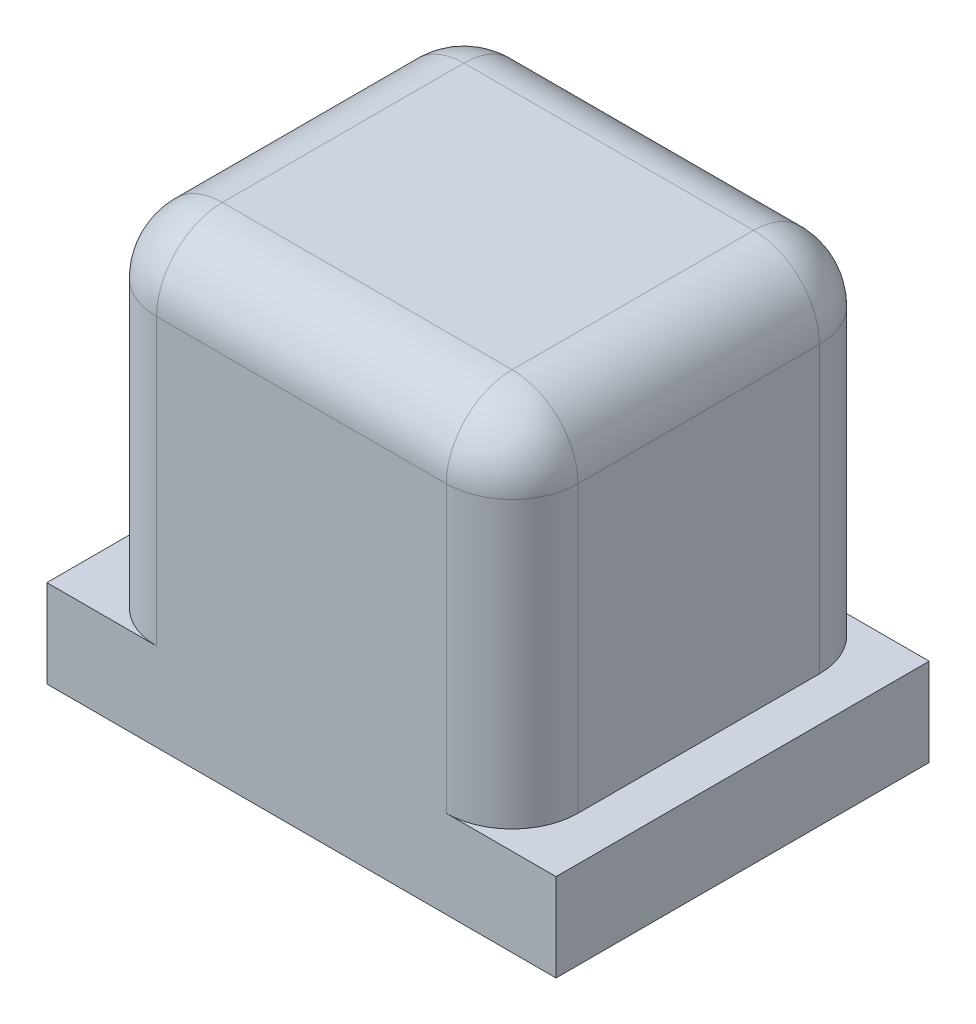
ISO-10303-21;
HEADER;
FILE_DESCRIPTION(('STEP AP214'),'2;1');
FILE_NAME('part.step','',(''),(''),'','','');
FILE_SCHEMA(('AUTOMOTIVE_DESIGN { 1 0 10303 214 1 1 1 1 }'));
ENDSEC;
DATA;
#1=APPLICATION_CONTEXT('core data for automotive mechanical design processes');
#2=APPLICATION_PROTOCOL_DEFINITION('international standard','automotive_design',2000,#1);
#3=PRODUCT_CONTEXT('',#1,'mechanical');
#4=PRODUCT('Part','Part','',(#3));
#5=PRODUCT_RELATED_PRODUCT_CATEGORY('part','',(#4));
#6=PRODUCT_DEFINITION_FORMATION('','',#4);
#7=PRODUCT_DEFINITION_CONTEXT('part definition',#1,'design');
#8=PRODUCT_DEFINITION('design','',#6,#7);
#9=PRODUCT_DEFINITION_SHAPE('','',#8);
#10=(LENGTH_UNIT() NAMED_UNIT(*) SI_UNIT(.MILLI.,.METRE.));
#11=(NAMED_UNIT(*) PLANE_ANGLE_UNIT() SI_UNIT($,.RADIAN.));
#12=(NAMED_UNIT(*) SI_UNIT($,.STERADIAN.) SOLID_ANGLE_UNIT());
#13=UNCERTAINTY_MEASURE_WITH_UNIT(LENGTH_MEASURE(1.E-05),#10,'distance_accuracy_value','');
#14=(GEOMETRIC_REPRESENTATION_CONTEXT(3) GLOBAL_UNCERTAINTY_ASSIGNED_CONTEXT((#13)) GLOBAL_UNIT_ASSIGNED_CONTEXT((#10,
#11,#12)) REPRESENTATION_CONTEXT('',''));
#15=CARTESIAN_POINT('',(0.,0.,0.));
#16=DIRECTION('',(0.,0.,1.));
#17=DIRECTION('',(1.,0.,0.));
#18=AXIS2_PLACEMENT_3D('',#15,#16,#17);
#19=CARTESIAN_POINT('',(0.,55.75,8.5));
#20=DIRECTION('',(0.,1.,0.));
#21=DIRECTION('',(0.,0.,1.));
#22=AXIS2_PLACEMENT_3D('',#19,#20,#21);
#23=PLANE('',#22);
#24=DIRECTION('',(1.,0.,0.));
#25=VECTOR('',#24,1.);
#26=CARTESIAN_POINT('',(-12.55,55.75,1.5));
#27=LINE('',#26,#25);
#28=CARTESIAN_POINT('',(-4.44999999999996,55.75,1.5));
#29=VERTEX_POINT('',#28);
#30=CARTESIAN_POINT('',(-11.05,55.75,1.5));
#31=VERTEX_POINT('',#30);
#32=EDGE_CURVE('E210',#29,#31,#27,.F.);
#33=ORIENTED_EDGE('',*,*,#32,.T.);
#34=DIRECTION('',(0.,0.,-1.));
#35=VECTOR('',#34,1.);
#36=CARTESIAN_POINT('',(-11.05,55.75,8.5));
#37=LINE('',#36,#35);
#38=CARTESIAN_POINT('',(-11.05,55.75,7.));
#39=VERTEX_POINT('',#38);
#40=EDGE_CURVE('E212',#31,#39,#37,.F.);
#41=ORIENTED_EDGE('',*,*,#40,.T.);
#42=DIRECTION('',(1.,0.,0.));
#43=VECTOR('',#42,1.);
#44=CARTESIAN_POINT('',(0.,55.75,7.));
#45=LINE('',#44,#43);
#46=CARTESIAN_POINT('',(-4.44999999999996,55.75,7.));
#47=VERTEX_POINT('',#46);
#48=EDGE_CURVE('E206',#39,#47,#45,.T.);
#49=ORIENTED_EDGE('',*,*,#48,.T.);
#50=DIRECTION('',(0.,0.,-1.));
#51=VECTOR('',#50,1.);
#52=CARTESIAN_POINT('',(-4.44999999999996,55.75,8.5));
#53=LINE('',#52,#51);
#54=EDGE_CURVE('E208',#47,#29,#53,.T.);
#55=ORIENTED_EDGE('',*,*,#54,.T.);
#56=EDGE_LOOP('',(#33,#41,#49,#55));
#57=FACE_BOUND('',#56,.T.);
#58=ADVANCED_FACE('F35',(#57),#23,.T.);
#59=CARTESIAN_POINT('',(-12.55,0.,8.5));
#60=DIRECTION('',(1.,0.,0.));
#61=DIRECTION('',(0.,1.,0.));
#62=AXIS2_PLACEMENT_3D('',#59,#60,#61);
#63=PLANE('',#62);
#64=DIRECTION('',(0.,0.,-1.));
#65=VECTOR('',#64,1.);
#66=CARTESIAN_POINT('',(-12.55,54.25,0.));
#67=LINE('',#66,#65);
#68=CARTESIAN_POINT('',(-12.55,54.25,7.));
#69=VERTEX_POINT('',#68);
#70=CARTESIAN_POINT('',(-12.55,54.25,1.5));
#71=VERTEX_POINT('',#70);
#72=EDGE_CURVE('E202',#69,#71,#67,.T.);
#73=ORIENTED_EDGE('',*,*,#72,.T.);
#74=DIRECTION('',(0.,-1.,0.));
#75=VECTOR('',#74,1.);
#76=CARTESIAN_POINT('',(-12.55,0.,1.5));
#77=LINE('',#76,#75);
#78=CARTESIAN_POINT('',(-12.55,47.75,1.5));
#79=VERTEX_POINT('',#78);
#80=EDGE_CURVE('E204',#71,#79,#77,.T.);
#81=ORIENTED_EDGE('',*,*,#80,.T.);
#82=DIRECTION('',(0.,0.,-1.));
#83=VECTOR('',#82,1.);
#84=CARTESIAN_POINT('',(-12.55,47.75,8.5));
#85=LINE('',#84,#83);
#86=CARTESIAN_POINT('',(-12.55,47.75,7.));
#87=VERTEX_POINT('',#86);
#88=EDGE_CURVE('E154',#87,#79,#85,.T.);
#89=ORIENTED_EDGE('',*,*,#88,.F.);
#90=DIRECTION('',(0.,-1.,0.));
#91=VECTOR('',#90,1.);
#92=CARTESIAN_POINT('',(-12.55,55.75,7.));
#93=LINE('',#92,#91);
#94=EDGE_CURVE('E200',#87,#69,#93,.F.);
#95=ORIENTED_EDGE('',*,*,#94,.T.);
#96=EDGE_LOOP('',(#73,#81,#89,#95));
#97=FACE_BOUND('',#96,.T.);
#98=ADVANCED_FACE('F268',(#97),#63,.F.);
#99=CARTESIAN_POINT('',(0.,47.75,8.5));
#100=DIRECTION('',(0.,-1.,0.));
#101=DIRECTION('',(0.,0.,-1.));
#102=AXIS2_PLACEMENT_3D('',#99,#100,#101);
#103=PLANE('',#102);
#104=DIRECTION('',(-1.,0.,0.));
#105=VECTOR('',#104,1.);
#106=CARTESIAN_POINT('',(0.,47.75,0.));
#107=LINE('',#106,#105);
#108=CARTESIAN_POINT('',(-11.05,47.75,0.));
#109=VERTEX_POINT('',#108);
#110=CARTESIAN_POINT('',(-13.55,47.75,0.));
#111=VERTEX_POINT('',#110);
#112=EDGE_CURVE('E150',#109,#111,#107,.T.);
#113=ORIENTED_EDGE('',*,*,#112,.T.);
#114=DIRECTION('',(0.,0.,-1.));
#115=VECTOR('',#114,1.);
#116=CARTESIAN_POINT('',(-13.55,47.75,8.5));
#117=LINE('',#116,#115);
#118=CARTESIAN_POINT('',(-13.55,47.75,8.5));
#119=VERTEX_POINT('',#118);
#120=EDGE_CURVE('E147',#119,#111,#117,.T.);
#121=ORIENTED_EDGE('',*,*,#120,.F.);
#122=DIRECTION('',(-1.,0.,0.));
#123=VECTOR('',#122,1.);
#124=CARTESIAN_POINT('',(0.,47.75,8.5));
#125=LINE('',#124,#123);
#126=CARTESIAN_POINT('',(-11.05,47.75,8.5));
#127=VERTEX_POINT('',#126);
#128=EDGE_CURVE('E135',#127,#119,#125,.T.);
#129=ORIENTED_EDGE('',*,*,#128,.F.);
#130=CARTESIAN_POINT('',(-11.05,47.75,7.));
#131=DIRECTION('',(0.,-1.,0.));
#132=DIRECTION('',(0.,0.,-1.));
#133=AXIS2_PLACEMENT_3D('',#130,#131,#132);
#134=CIRCLE('',#133,1.5);
#135=EDGE_CURVE('E11',#127,#87,#134,.T.);
#136=ORIENTED_EDGE('',*,*,#135,.T.);
#137=ORIENTED_EDGE('',*,*,#88,.T.);
#138=CARTESIAN_POINT('',(-11.05,47.75,1.5));
#139=DIRECTION('',(0.,-1.,0.));
#140=DIRECTION('',(0.,0.,-1.));
#141=AXIS2_PLACEMENT_3D('',#138,#139,#140);
#142=CIRCLE('',#141,1.5);
#143=EDGE_CURVE('E221',#79,#109,#142,.T.);
#144=ORIENTED_EDGE('',*,*,#143,.T.);
#145=EDGE_LOOP('',(#113,#121,#129,#136,#137,#144));
#146=FACE_BOUND('',#145,.T.);
#147=ADVANCED_FACE('F148',(#146),#103,.F.);
#148=CARTESIAN_POINT('',(-13.5499999999999,0.,8.5));
#149=DIRECTION('',(-1.,0.,0.));
#150=DIRECTION('',(0.,-1.,0.));
#151=AXIS2_PLACEMENT_3D('',#148,#149,#150);
#152=PLANE('',#151);
#153=DIRECTION('',(0.,1.,0.));
#154=VECTOR('',#153,1.);
#155=CARTESIAN_POINT('',(-13.5499999999999,0.,0.));
#156=LINE('',#155,#154);
#157=CARTESIAN_POINT('',(-13.55,45.75,0.));
#158=VERTEX_POINT('',#157);
#159=EDGE_CURVE('E168',#158,#111,#156,.T.);
#160=ORIENTED_EDGE('',*,*,#159,.F.);
#161=DIRECTION('',(0.,0.,-1.));
#162=VECTOR('',#161,1.);
#163=CARTESIAN_POINT('',(-13.55,45.75,8.5));
#164=LINE('',#163,#162);
#165=CARTESIAN_POINT('',(-13.55,45.75,8.5));
#166=VERTEX_POINT('',#165);
#167=EDGE_CURVE('E155',#166,#158,#164,.T.);
#168=ORIENTED_EDGE('',*,*,#167,.F.);
#169=DIRECTION('',(0.,1.,0.));
#170=VECTOR('',#169,1.);
#171=CARTESIAN_POINT('',(-13.5499999999999,0.,8.5));
#172=LINE('',#171,#170);
#173=EDGE_CURVE('E139',#166,#119,#172,.T.);
#174=ORIENTED_EDGE('',*,*,#173,.T.);
#175=ORIENTED_EDGE('',*,*,#120,.T.);
#176=EDGE_LOOP('',(#160,#168,#174,#175));
#177=FACE_BOUND('',#176,.T.);
#178=ADVANCED_FACE('F157',(#177),#152,.T.);
#179=CARTESIAN_POINT('',(0.,45.75,8.5));
#180=DIRECTION('',(0.,1.,0.));
#181=DIRECTION('',(0.,0.,1.));
#182=AXIS2_PLACEMENT_3D('',#179,#180,#181);
#183=PLANE('',#182);
#184=DIRECTION('',(1.,0.,0.));
#185=VECTOR('',#184,1.);
#186=CARTESIAN_POINT('',(0.,45.75,0.));
#187=LINE('',#186,#185);
#188=CARTESIAN_POINT('',(-1.94999999999996,45.75,0.));
#189=VERTEX_POINT('',#188);
#190=EDGE_CURVE('E170',#158,#189,#187,.T.);
#191=ORIENTED_EDGE('',*,*,#190,.T.);
#192=DIRECTION('',(0.,0.,-1.));
#193=VECTOR('',#192,1.);
#194=CARTESIAN_POINT('',(-1.94999999999996,45.75,8.5));
#195=LINE('',#194,#193);
#196=CARTESIAN_POINT('',(-1.94999999999996,45.75,8.5));
#197=VERTEX_POINT('',#196);
#198=EDGE_CURVE('E181',#197,#189,#195,.T.);
#199=ORIENTED_EDGE('',*,*,#198,.F.);
#200=DIRECTION('',(1.,0.,0.));
#201=VECTOR('',#200,1.);
#202=CARTESIAN_POINT('',(0.,45.75,8.5));
#203=LINE('',#202,#201);
#204=EDGE_CURVE('E159',#166,#197,#203,.T.);
#205=ORIENTED_EDGE('',*,*,#204,.F.);
#206=ORIENTED_EDGE('',*,*,#167,.T.);
#207=EDGE_LOOP('',(#191,#199,#205,#206));
#208=FACE_BOUND('',#207,.T.);
#209=ADVANCED_FACE('F294',(#208),#183,.F.);
#210=CARTESIAN_POINT('',(-1.94999999999995,0.,8.5));
#211=DIRECTION('',(-1.,0.,0.));
#212=DIRECTION('',(0.,-1.,0.));
#213=AXIS2_PLACEMENT_3D('',#210,#211,#212);
#214=PLANE('',#213);
#215=DIRECTION('',(0.,1.,0.));
#216=VECTOR('',#215,1.);
#217=CARTESIAN_POINT('',(-1.94999999999995,0.,0.));
#218=LINE('',#217,#216);
#219=CARTESIAN_POINT('',(-1.94999999999996,47.75,0.));
#220=VERTEX_POINT('',#219);
#221=EDGE_CURVE('E172',#189,#220,#218,.T.);
#222=ORIENTED_EDGE('',*,*,#221,.T.);
#223=DIRECTION('',(0.,0.,-1.));
#224=VECTOR('',#223,1.);
#225=CARTESIAN_POINT('',(-1.94999999999996,47.75,8.5));
#226=LINE('',#225,#224);
#227=CARTESIAN_POINT('',(-1.94999999999996,47.75,8.5));
#228=VERTEX_POINT('',#227);
#229=EDGE_CURVE('E179',#228,#220,#226,.T.);
#230=ORIENTED_EDGE('',*,*,#229,.F.);
#231=DIRECTION('',(0.,1.,0.));
#232=VECTOR('',#231,1.);
#233=CARTESIAN_POINT('',(-1.94999999999995,0.,8.5));
#234=LINE('',#233,#232);
#235=EDGE_CURVE('E161',#197,#228,#234,.T.);
#236=ORIENTED_EDGE('',*,*,#235,.F.);
#237=ORIENTED_EDGE('',*,*,#198,.T.);
#238=EDGE_LOOP('',(#222,#230,#236,#237));
#239=FACE_BOUND('',#238,.T.);
#240=ADVANCED_FACE('F297',(#239),#214,.F.);
#241=CARTESIAN_POINT('',(0.,47.75,8.5));
#242=DIRECTION('',(0.,1.,0.));
#243=DIRECTION('',(0.,0.,1.));
#244=AXIS2_PLACEMENT_3D('',#241,#242,#243);
#245=PLANE('',#244);
#246=DIRECTION('',(1.,0.,0.));
#247=VECTOR('',#246,1.);
#248=CARTESIAN_POINT('',(0.,47.75,0.));
#249=LINE('',#248,#247);
#250=CARTESIAN_POINT('',(-4.44999999999996,47.75,0.));
#251=VERTEX_POINT('',#250);
#252=EDGE_CURVE('E144',#251,#220,#249,.T.);
#253=ORIENTED_EDGE('',*,*,#252,.F.);
#254=CARTESIAN_POINT('',(-4.44999999999996,47.75,1.5));
#255=DIRECTION('',(0.,1.,0.));
#256=DIRECTION('',(0.,0.,1.));
#257=AXIS2_PLACEMENT_3D('',#254,#255,#256);
#258=CIRCLE('',#257,1.5);
#259=CARTESIAN_POINT('',(-2.94999999999996,47.75,1.5));
#260=VERTEX_POINT('',#259);
#261=EDGE_CURVE('E219',#251,#260,#258,.F.);
#262=ORIENTED_EDGE('',*,*,#261,.T.);
#263=DIRECTION('',(0.,0.,-1.));
#264=VECTOR('',#263,1.);
#265=CARTESIAN_POINT('',(-2.94999999999996,47.75,8.5));
#266=LINE('',#265,#264);
#267=CARTESIAN_POINT('',(-2.94999999999996,47.75,7.));
#268=VERTEX_POINT('',#267);
#269=EDGE_CURVE('E166',#268,#260,#266,.T.);
#270=ORIENTED_EDGE('',*,*,#269,.F.);
#271=CARTESIAN_POINT('',(-4.44999999999996,47.75,7.));
#272=DIRECTION('',(0.,1.,0.));
#273=DIRECTION('',(0.,0.,1.));
#274=AXIS2_PLACEMENT_3D('',#271,#272,#273);
#275=CIRCLE('',#274,1.5);
#276=CARTESIAN_POINT('',(-4.44999999999996,47.75,8.5));
#277=VERTEX_POINT('',#276);
#278=EDGE_CURVE('E44',#268,#277,#275,.F.);
#279=ORIENTED_EDGE('',*,*,#278,.T.);
#280=DIRECTION('',(1.,0.,0.));
#281=VECTOR('',#280,1.);
#282=CARTESIAN_POINT('',(0.,47.75,8.5));
#283=LINE('',#282,#281);
#284=EDGE_CURVE('E52',#277,#228,#283,.T.);
#285=ORIENTED_EDGE('',*,*,#284,.T.);
#286=ORIENTED_EDGE('',*,*,#229,.T.);
#287=EDGE_LOOP('',(#253,#262,#270,#279,#285,#286));
#288=FACE_BOUND('',#287,.T.);
#289=ADVANCED_FACE('F300',(#288),#245,.T.);
#290=CARTESIAN_POINT('',(-2.94999999999996,0.,8.5));
#291=DIRECTION('',(1.,0.,0.));
#292=DIRECTION('',(0.,1.,0.));
#293=AXIS2_PLACEMENT_3D('',#290,#291,#292);
#294=PLANE('',#293);
#295=ORIENTED_EDGE('',*,*,#269,.T.);
#296=DIRECTION('',(0.,-1.,0.));
#297=VECTOR('',#296,1.);
#298=CARTESIAN_POINT('',(-2.94999999999996,55.75,1.5));
#299=LINE('',#298,#297);
#300=CARTESIAN_POINT('',(-2.94999999999996,54.25,1.5));
#301=VERTEX_POINT('',#300);
#302=EDGE_CURVE('E198',#260,#301,#299,.F.);
#303=ORIENTED_EDGE('',*,*,#302,.T.);
#304=DIRECTION('',(0.,0.,-1.));
#305=VECTOR('',#304,1.);
#306=CARTESIAN_POINT('',(-2.94999999999996,54.25,8.5));
#307=LINE('',#306,#305);
#308=CARTESIAN_POINT('',(-2.94999999999996,54.25,7.));
#309=VERTEX_POINT('',#308);
#310=EDGE_CURVE('E196',#301,#309,#307,.F.);
#311=ORIENTED_EDGE('',*,*,#310,.T.);
#312=DIRECTION('',(0.,-1.,0.));
#313=VECTOR('',#312,1.);
#314=CARTESIAN_POINT('',(-2.94999999999996,0.,7.));
#315=LINE('',#314,#313);
#316=EDGE_CURVE('E194',#309,#268,#315,.T.);
#317=ORIENTED_EDGE('',*,*,#316,.T.);
#318=EDGE_LOOP('',(#295,#303,#311,#317));
#319=FACE_BOUND('',#318,.T.);
#320=ADVANCED_FACE('F325',(#319),#294,.T.);
#321=CARTESIAN_POINT('',(0.,0.,8.5));
#322=DIRECTION('',(0.,0.,1.));
#323=DIRECTION('',(1.,0.,0.));
#324=AXIS2_PLACEMENT_3D('',#321,#322,#323);
#325=PLANE('',#324);
#326=ORIENTED_EDGE('',*,*,#284,.F.);
#327=DIRECTION('',(0.,-1.,0.));
#328=VECTOR('',#327,1.);
#329=CARTESIAN_POINT('',(-4.44999999999996,0.,8.5));
#330=LINE('',#329,#328);
#331=CARTESIAN_POINT('',(-4.44999999999996,54.25,8.5));
#332=VERTEX_POINT('',#331);
#333=EDGE_CURVE('E57',#277,#332,#330,.F.);
#334=ORIENTED_EDGE('',*,*,#333,.T.);
#335=DIRECTION('',(1.,0.,0.));
#336=VECTOR('',#335,1.);
#337=CARTESIAN_POINT('',(0.,54.25,8.5));
#338=LINE('',#337,#336);
#339=CARTESIAN_POINT('',(-11.05,54.25,8.5));
#340=VERTEX_POINT('',#339);
#341=EDGE_CURVE('E216',#332,#340,#338,.F.);
#342=ORIENTED_EDGE('',*,*,#341,.T.);
#343=DIRECTION('',(0.,-1.,0.));
#344=VECTOR('',#343,1.);
#345=CARTESIAN_POINT('',(-11.05,47.75,8.5));
#346=LINE('',#345,#344);
#347=EDGE_CURVE('E141',#340,#127,#346,.T.);
#348=ORIENTED_EDGE('',*,*,#347,.T.);
#349=ORIENTED_EDGE('',*,*,#128,.T.);
#350=ORIENTED_EDGE('',*,*,#173,.F.);
#351=ORIENTED_EDGE('',*,*,#204,.T.);
#352=ORIENTED_EDGE('',*,*,#235,.T.);
#353=EDGE_LOOP('',(#326,#334,#342,#348,#349,#350,#351,#352));
#354=FACE_BOUND('',#353,.T.);
#355=ADVANCED_FACE('F137',(#354),#325,.T.);
#356=CARTESIAN_POINT('',(0.,0.,0.));
#357=DIRECTION('',(0.,0.,1.));
#358=DIRECTION('',(1.,0.,0.));
#359=AXIS2_PLACEMENT_3D('',#356,#357,#358);
#360=PLANE('',#359);
#361=DIRECTION('',(0.,-1.,0.));
#362=VECTOR('',#361,1.);
#363=CARTESIAN_POINT('',(-4.44999999999996,47.75,0.));
#364=LINE('',#363,#362);
#365=CARTESIAN_POINT('',(-4.44999999999996,54.25,0.));
#366=VERTEX_POINT('',#365);
#367=EDGE_CURVE('E191',#366,#251,#364,.T.);
#368=ORIENTED_EDGE('',*,*,#367,.T.);
#369=ORIENTED_EDGE('',*,*,#252,.T.);
#370=ORIENTED_EDGE('',*,*,#221,.F.);
#371=ORIENTED_EDGE('',*,*,#190,.F.);
#372=ORIENTED_EDGE('',*,*,#159,.T.);
#373=ORIENTED_EDGE('',*,*,#112,.F.);
#374=DIRECTION('',(0.,-1.,0.));
#375=VECTOR('',#374,1.);
#376=CARTESIAN_POINT('',(-11.05,0.,0.));
#377=LINE('',#376,#375);
#378=CARTESIAN_POINT('',(-11.05,54.25,0.));
#379=VERTEX_POINT('',#378);
#380=EDGE_CURVE('E189',#109,#379,#377,.F.);
#381=ORIENTED_EDGE('',*,*,#380,.T.);
#382=DIRECTION('',(1.,0.,0.));
#383=VECTOR('',#382,1.);
#384=CARTESIAN_POINT('',(-2.94999999999996,54.25,0.));
#385=LINE('',#384,#383);
#386=EDGE_CURVE('E187',#379,#366,#385,.T.);
#387=ORIENTED_EDGE('',*,*,#386,.T.);
#388=EDGE_LOOP('',(#368,#369,#370,#371,#372,#373,#381,#387));
#389=FACE_BOUND('',#388,.T.);
#390=ADVANCED_FACE('F288',(#389),#360,.F.);
#391=CARTESIAN_POINT('',(-11.05,0.,7.));
#392=DIRECTION('',(0.,1.,0.));
#393=DIRECTION('',(-1.,0.,0.));
#394=AXIS2_PLACEMENT_3D('',#391,#392,#393);
#395=CYLINDRICAL_SURFACE('',#394,1.5);
#396=CARTESIAN_POINT('',(-11.05,54.25,7.));
#397=DIRECTION('',(0.,1.,0.));
#398=DIRECTION('',(0.,0.,1.));
#399=AXIS2_PLACEMENT_3D('',#396,#397,#398);
#400=CIRCLE('',#399,1.5);
#401=EDGE_CURVE('E39',#69,#340,#400,.T.);
#402=ORIENTED_EDGE('',*,*,#401,.F.);
#403=ORIENTED_EDGE('',*,*,#94,.F.);
#404=ORIENTED_EDGE('',*,*,#135,.F.);
#405=ORIENTED_EDGE('',*,*,#347,.F.);
#406=EDGE_LOOP('',(#402,#403,#404,#405));
#407=FACE_BOUND('',#406,.T.);
#408=ADVANCED_FACE('F37',(#407),#395,.T.);
#409=CARTESIAN_POINT('',(-11.05,54.25,7.));
#410=DIRECTION('',(0.,0.,1.));
#411=DIRECTION('',(1.,0.,0.));
#412=AXIS2_PLACEMENT_3D('',#409,#410,#411);
#413=SPHERICAL_SURFACE('',#412,1.5);
#414=CARTESIAN_POINT('',(-11.05,54.25,7.));
#415=DIRECTION('',(0.,0.,1.));
#416=DIRECTION('',(1.,0.,0.));
#417=AXIS2_PLACEMENT_3D('',#414,#415,#416);
#418=CIRCLE('',#417,1.5);
#419=EDGE_CURVE('E251',#69,#39,#418,.F.);
#420=ORIENTED_EDGE('',*,*,#419,.F.);
#421=ORIENTED_EDGE('',*,*,#401,.T.);
#422=CARTESIAN_POINT('',(-11.05,54.25,7.));
#423=DIRECTION('',(-1.,0.,0.));
#424=DIRECTION('',(0.,-1.,0.));
#425=AXIS2_PLACEMENT_3D('',#422,#423,#424);
#426=CIRCLE('',#425,1.5);
#427=EDGE_CURVE('E253',#39,#340,#426,.F.);
#428=ORIENTED_EDGE('',*,*,#427,.F.);
#429=EDGE_LOOP('',(#420,#421,#428));
#430=FACE_BOUND('',#429,.T.);
#431=ADVANCED_FACE('F261',(#430),#413,.T.);
#432=CARTESIAN_POINT('',(-4.44999999999996,0.,7.));
#433=DIRECTION('',(0.,-1.,0.));
#434=DIRECTION('',(1.,0.,0.));
#435=AXIS2_PLACEMENT_3D('',#432,#433,#434);
#436=CYLINDRICAL_SURFACE('',#435,1.5);
#437=ORIENTED_EDGE('',*,*,#278,.F.);
#438=ORIENTED_EDGE('',*,*,#316,.F.);
#439=CARTESIAN_POINT('',(-4.44999999999996,54.25,7.));
#440=DIRECTION('',(0.,1.,0.));
#441=DIRECTION('',(0.,0.,1.));
#442=AXIS2_PLACEMENT_3D('',#439,#440,#441);
#443=CIRCLE('',#442,1.5);
#444=EDGE_CURVE('E248',#332,#309,#443,.T.);
#445=ORIENTED_EDGE('',*,*,#444,.F.);
#446=ORIENTED_EDGE('',*,*,#333,.F.);
#447=EDGE_LOOP('',(#437,#438,#445,#446));
#448=FACE_BOUND('',#447,.T.);
#449=ADVANCED_FACE('F306',(#448),#436,.T.);
#450=CARTESIAN_POINT('',(0.,54.25,7.));
#451=DIRECTION('',(1.,0.,0.));
#452=DIRECTION('',(0.,0.,-1.));
#453=AXIS2_PLACEMENT_3D('',#450,#451,#452);
#454=CYLINDRICAL_SURFACE('',#453,1.5);
#455=ORIENTED_EDGE('',*,*,#427,.T.);
#456=ORIENTED_EDGE('',*,*,#341,.F.);
#457=CARTESIAN_POINT('',(-4.44999999999996,54.25,7.));
#458=DIRECTION('',(1.,0.,0.));
#459=DIRECTION('',(0.,0.,-1.));
#460=AXIS2_PLACEMENT_3D('',#457,#458,#459);
#461=CIRCLE('',#460,1.5);
#462=EDGE_CURVE('E245',#47,#332,#461,.T.);
#463=ORIENTED_EDGE('',*,*,#462,.F.);
#464=ORIENTED_EDGE('',*,*,#48,.F.);
#465=EDGE_LOOP('',(#455,#456,#463,#464));
#466=FACE_BOUND('',#465,.T.);
#467=ADVANCED_FACE('F312',(#466),#454,.T.);
#468=CARTESIAN_POINT('',(-11.05,54.25,8.5));
#469=DIRECTION('',(0.,0.,1.));
#470=DIRECTION('',(1.,0.,0.));
#471=AXIS2_PLACEMENT_3D('',#468,#469,#470);
#472=CYLINDRICAL_SURFACE('',#471,1.5);
#473=ORIENTED_EDGE('',*,*,#419,.T.);
#474=ORIENTED_EDGE('',*,*,#40,.F.);
#475=CARTESIAN_POINT('',(-11.05,54.25,1.5));
#476=DIRECTION('',(0.,0.,-1.));
#477=DIRECTION('',(0.,1.,0.));
#478=AXIS2_PLACEMENT_3D('',#475,#476,#477);
#479=CIRCLE('',#478,1.5);
#480=EDGE_CURVE('E242',#71,#31,#479,.T.);
#481=ORIENTED_EDGE('',*,*,#480,.F.);
#482=ORIENTED_EDGE('',*,*,#72,.F.);
#483=EDGE_LOOP('',(#473,#474,#481,#482));
#484=FACE_BOUND('',#483,.T.);
#485=ADVANCED_FACE('F278',(#484),#472,.T.);
#486=CARTESIAN_POINT('',(-11.05,0.,1.5));
#487=DIRECTION('',(0.,-1.,0.));
#488=DIRECTION('',(1.,0.,0.));
#489=AXIS2_PLACEMENT_3D('',#486,#487,#488);
#490=CYLINDRICAL_SURFACE('',#489,1.5);
#491=ORIENTED_EDGE('',*,*,#143,.F.);
#492=ORIENTED_EDGE('',*,*,#80,.F.);
#493=CARTESIAN_POINT('',(-11.05,54.25,1.5));
#494=DIRECTION('',(0.,1.,0.));
#495=DIRECTION('',(0.,0.,1.));
#496=AXIS2_PLACEMENT_3D('',#493,#494,#495);
#497=CIRCLE('',#496,1.5);
#498=EDGE_CURVE('E239',#379,#71,#497,.T.);
#499=ORIENTED_EDGE('',*,*,#498,.F.);
#500=ORIENTED_EDGE('',*,*,#380,.F.);
#501=EDGE_LOOP('',(#491,#492,#499,#500));
#502=FACE_BOUND('',#501,.T.);
#503=ADVANCED_FACE('F273',(#502),#490,.T.);
#504=CARTESIAN_POINT('',(-4.44999999999996,54.25,7.));
#505=DIRECTION('',(0.,0.,1.));
#506=DIRECTION('',(1.,0.,0.));
#507=AXIS2_PLACEMENT_3D('',#504,#505,#506);
#508=SPHERICAL_SURFACE('',#507,1.5);
#509=ORIENTED_EDGE('',*,*,#462,.T.);
#510=ORIENTED_EDGE('',*,*,#444,.T.);
#511=CARTESIAN_POINT('',(-4.44999999999996,54.25,7.));
#512=DIRECTION('',(0.,0.,1.));
#513=DIRECTION('',(1.,0.,0.));
#514=AXIS2_PLACEMENT_3D('',#511,#512,#513);
#515=CIRCLE('',#514,1.5);
#516=EDGE_CURVE('E236',#47,#309,#515,.F.);
#517=ORIENTED_EDGE('',*,*,#516,.F.);
#518=EDGE_LOOP('',(#509,#510,#517));
#519=FACE_BOUND('',#518,.T.);
#520=ADVANCED_FACE('F310',(#519),#508,.T.);
#521=CARTESIAN_POINT('',(-11.05,54.25,1.5));
#522=DIRECTION('',(-1.,0.,0.));
#523=DIRECTION('',(0.,0.,1.));
#524=AXIS2_PLACEMENT_3D('',#521,#522,#523);
#525=SPHERICAL_SURFACE('',#524,1.5);
#526=ORIENTED_EDGE('',*,*,#498,.T.);
#527=ORIENTED_EDGE('',*,*,#480,.T.);
#528=CARTESIAN_POINT('',(-11.05,54.25,1.5));
#529=DIRECTION('',(-1.,0.,0.));
#530=DIRECTION('',(0.,0.,1.));
#531=AXIS2_PLACEMENT_3D('',#528,#529,#530);
#532=CIRCLE('',#531,1.5);
#533=EDGE_CURVE('E233',#379,#31,#532,.F.);
#534=ORIENTED_EDGE('',*,*,#533,.F.);
#535=EDGE_LOOP('',(#526,#527,#534));
#536=FACE_BOUND('',#535,.T.);
#537=ADVANCED_FACE('F280',(#536),#525,.T.);
#538=CARTESIAN_POINT('',(-4.44999999999996,54.25,8.5));
#539=DIRECTION('',(0.,0.,-1.));
#540=DIRECTION('',(-1.,0.,0.));
#541=AXIS2_PLACEMENT_3D('',#538,#539,#540);
#542=CYLINDRICAL_SURFACE('',#541,1.5);
#543=ORIENTED_EDGE('',*,*,#516,.T.);
#544=ORIENTED_EDGE('',*,*,#310,.F.);
#545=CARTESIAN_POINT('',(-4.44999999999996,54.25,1.5));
#546=DIRECTION('',(0.,0.,-1.));
#547=DIRECTION('',(-1.,0.,0.));
#548=AXIS2_PLACEMENT_3D('',#545,#546,#547);
#549=CIRCLE('',#548,1.5);
#550=EDGE_CURVE('E230',#29,#301,#549,.T.);
#551=ORIENTED_EDGE('',*,*,#550,.F.);
#552=ORIENTED_EDGE('',*,*,#54,.F.);
#553=EDGE_LOOP('',(#543,#544,#551,#552));
#554=FACE_BOUND('',#553,.T.);
#555=ADVANCED_FACE('F317',(#554),#542,.T.);
#556=CARTESIAN_POINT('',(0.,54.25,1.5));
#557=DIRECTION('',(-1.,0.,0.));
#558=DIRECTION('',(0.,0.,1.));
#559=AXIS2_PLACEMENT_3D('',#556,#557,#558);
#560=CYLINDRICAL_SURFACE('',#559,1.5);
#561=ORIENTED_EDGE('',*,*,#533,.T.);
#562=ORIENTED_EDGE('',*,*,#32,.F.);
#563=CARTESIAN_POINT('',(-4.44999999999996,54.25,1.5));
#564=DIRECTION('',(1.,0.,0.));
#565=DIRECTION('',(0.,1.,0.));
#566=AXIS2_PLACEMENT_3D('',#563,#564,#565);
#567=CIRCLE('',#566,1.5);
#568=EDGE_CURVE('E227',#366,#29,#567,.T.);
#569=ORIENTED_EDGE('',*,*,#568,.F.);
#570=ORIENTED_EDGE('',*,*,#386,.F.);
#571=EDGE_LOOP('',(#561,#562,#569,#570));
#572=FACE_BOUND('',#571,.T.);
#573=ADVANCED_FACE('F285',(#572),#560,.T.);
#574=CARTESIAN_POINT('',(-4.44999999999996,54.25,1.5));
#575=DIRECTION('',(0.,1.,0.));
#576=DIRECTION('',(0.,0.,1.));
#577=AXIS2_PLACEMENT_3D('',#574,#575,#576);
#578=SPHERICAL_SURFACE('',#577,1.5);
#579=ORIENTED_EDGE('',*,*,#568,.T.);
#580=ORIENTED_EDGE('',*,*,#550,.T.);
#581=CARTESIAN_POINT('',(-4.44999999999996,54.25,1.5));
#582=DIRECTION('',(0.,1.,0.));
#583=DIRECTION('',(0.,0.,1.));
#584=AXIS2_PLACEMENT_3D('',#581,#582,#583);
#585=CIRCLE('',#584,1.5);
#586=EDGE_CURVE('E224',#366,#301,#585,.F.);
#587=ORIENTED_EDGE('',*,*,#586,.F.);
#588=EDGE_LOOP('',(#579,#580,#587));
#589=FACE_BOUND('',#588,.T.);
#590=ADVANCED_FACE('F319',(#589),#578,.T.);
#591=CARTESIAN_POINT('',(-4.44999999999996,0.,1.5));
#592=DIRECTION('',(0.,1.,0.));
#593=DIRECTION('',(-1.,0.,0.));
#594=AXIS2_PLACEMENT_3D('',#591,#592,#593);
#595=CYLINDRICAL_SURFACE('',#594,1.5);
#596=ORIENTED_EDGE('',*,*,#586,.T.);
#597=ORIENTED_EDGE('',*,*,#302,.F.);
#598=ORIENTED_EDGE('',*,*,#261,.F.);
#599=ORIENTED_EDGE('',*,*,#367,.F.);
#600=EDGE_LOOP('',(#596,#597,#598,#599));
#601=FACE_BOUND('',#600,.T.);
#602=ADVANCED_FACE('F323',(#601),#595,.T.);
#603=CLOSED_SHELL('',(#58,#98,#147,#178,#209,#240,#289,#320,#355,#390,#408,#431,#449,#467,#485,
#503,#520,#537,#555,#573,#590,#602));
#604=MANIFOLD_SOLID_BREP('B2',#603);
#605=ADVANCED_BREP_SHAPE_REPRESENTATION('',(#18,#604),#14);
#606=SHAPE_DEFINITION_REPRESENTATION(#9,#605);
ENDSEC;
END-ISO-10303-21;
